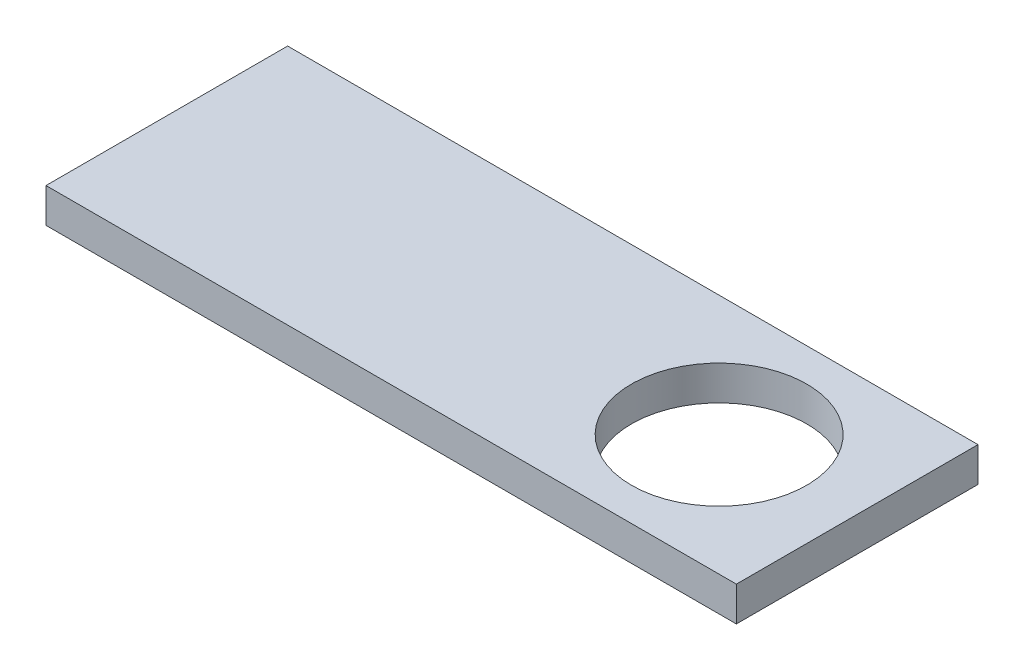
ISO-10303-21;
HEADER;
FILE_DESCRIPTION(('STEP AP214'),'2;1');
FILE_NAME('part.step','',(''),(''),'','','');
FILE_SCHEMA(('AUTOMOTIVE_DESIGN { 1 0 10303 214 1 1 1 1 }'));
ENDSEC;
DATA;
#1=APPLICATION_CONTEXT('core data for automotive mechanical design processes');
#2=APPLICATION_PROTOCOL_DEFINITION('international standard','automotive_design',2000,#1);
#3=PRODUCT_CONTEXT('',#1,'mechanical');
#4=PRODUCT('Part','Part','',(#3));
#5=PRODUCT_RELATED_PRODUCT_CATEGORY('part','',(#4));
#6=PRODUCT_DEFINITION_FORMATION('','',#4);
#7=PRODUCT_DEFINITION_CONTEXT('part definition',#1,'design');
#8=PRODUCT_DEFINITION('design','',#6,#7);
#9=PRODUCT_DEFINITION_SHAPE('','',#8);
#10=(LENGTH_UNIT() NAMED_UNIT(*) SI_UNIT(.MILLI.,.METRE.));
#11=(NAMED_UNIT(*) PLANE_ANGLE_UNIT() SI_UNIT($,.RADIAN.));
#12=(NAMED_UNIT(*) SI_UNIT($,.STERADIAN.) SOLID_ANGLE_UNIT());
#13=UNCERTAINTY_MEASURE_WITH_UNIT(LENGTH_MEASURE(1.E-05),#10,'distance_accuracy_value','');
#14=(GEOMETRIC_REPRESENTATION_CONTEXT(3) GLOBAL_UNCERTAINTY_ASSIGNED_CONTEXT((#13)) GLOBAL_UNIT_ASSIGNED_CONTEXT((#10,
#11,#12)) REPRESENTATION_CONTEXT('',''));
#15=CARTESIAN_POINT('',(0.,0.,0.));
#16=DIRECTION('',(0.,0.,1.));
#17=DIRECTION('',(1.,0.,0.));
#18=AXIS2_PLACEMENT_3D('',#15,#16,#17);
#19=CARTESIAN_POINT('',(0.,5.,0.));
#20=DIRECTION('',(0.,-1.,0.));
#21=DIRECTION('',(0.,0.,-1.));
#22=AXIS2_PLACEMENT_3D('',#19,#20,#21);
#23=PLANE('',#22);
#24=DIRECTION('',(0.,0.,-1.));
#25=VECTOR('',#24,1.);
#26=CARTESIAN_POINT('',(100.,5.,35.));
#27=LINE('',#26,#25);
#28=CARTESIAN_POINT('',(100.,5.,35.));
#29=VERTEX_POINT('',#28);
#30=CARTESIAN_POINT('',(100.,5.,-35.));
#31=VERTEX_POINT('',#30);
#32=EDGE_CURVE('E90',#29,#31,#27,.T.);
#33=ORIENTED_EDGE('',*,*,#32,.T.);
#34=DIRECTION('',(-1.,0.,0.));
#35=VECTOR('',#34,1.);
#36=CARTESIAN_POINT('',(-100.,5.,-35.));
#37=LINE('',#36,#35);
#38=CARTESIAN_POINT('',(-100.,5.,-35.));
#39=VERTEX_POINT('',#38);
#40=EDGE_CURVE('E85',#31,#39,#37,.T.);
#41=ORIENTED_EDGE('',*,*,#40,.T.);
#42=DIRECTION('',(0.,0.,1.));
#43=VECTOR('',#42,1.);
#44=CARTESIAN_POINT('',(-100.,5.,35.));
#45=LINE('',#44,#43);
#46=CARTESIAN_POINT('',(-100.,5.,35.));
#47=VERTEX_POINT('',#46);
#48=EDGE_CURVE('E88',#39,#47,#45,.T.);
#49=ORIENTED_EDGE('',*,*,#48,.T.);
#50=DIRECTION('',(1.,0.,0.));
#51=VECTOR('',#50,1.);
#52=CARTESIAN_POINT('',(-100.,5.,35.));
#53=LINE('',#52,#51);
#54=EDGE_CURVE('E55',#47,#29,#53,.T.);
#55=ORIENTED_EDGE('',*,*,#54,.T.);
#56=EDGE_LOOP('',(#33,#41,#49,#55));
#57=FACE_BOUND('',#56,.T.);
#58=CARTESIAN_POINT('',(60.,5.,0.));
#59=DIRECTION('',(0.,1.,0.));
#60=DIRECTION('',(0.,0.,1.));
#61=AXIS2_PLACEMENT_3D('',#58,#59,#60);
#62=CIRCLE('',#61,25.4);
#63=CARTESIAN_POINT('',(60.,5.,25.4));
#64=VERTEX_POINT('',#63);
#65=EDGE_CURVE('E105',#64,#64,#62,.T.);
#66=ORIENTED_EDGE('',*,*,#65,.F.);
#67=EDGE_LOOP('',(#66));
#68=FACE_BOUND('',#67,.T.);
#69=ADVANCED_FACE('F38',(#57,#68),#23,.F.);
#70=CARTESIAN_POINT('',(0.,-5.,0.));
#71=DIRECTION('',(0.,-1.,0.));
#72=DIRECTION('',(0.,0.,-1.));
#73=AXIS2_PLACEMENT_3D('',#70,#71,#72);
#74=PLANE('',#73);
#75=DIRECTION('',(0.,0.,-1.));
#76=VECTOR('',#75,1.);
#77=CARTESIAN_POINT('',(100.,-5.,35.));
#78=LINE('',#77,#76);
#79=CARTESIAN_POINT('',(100.,-5.,35.));
#80=VERTEX_POINT('',#79);
#81=CARTESIAN_POINT('',(100.,-5.,-35.));
#82=VERTEX_POINT('',#81);
#83=EDGE_CURVE('E102',#80,#82,#78,.T.);
#84=ORIENTED_EDGE('',*,*,#83,.F.);
#85=DIRECTION('',(1.,0.,0.));
#86=VECTOR('',#85,1.);
#87=CARTESIAN_POINT('',(-100.,-5.,35.));
#88=LINE('',#87,#86);
#89=CARTESIAN_POINT('',(-100.,-5.,35.));
#90=VERTEX_POINT('',#89);
#91=EDGE_CURVE('E78',#90,#80,#88,.T.);
#92=ORIENTED_EDGE('',*,*,#91,.F.);
#93=DIRECTION('',(0.,0.,1.));
#94=VECTOR('',#93,1.);
#95=CARTESIAN_POINT('',(-100.,-5.,35.));
#96=LINE('',#95,#94);
#97=CARTESIAN_POINT('',(-100.,-5.,-35.));
#98=VERTEX_POINT('',#97);
#99=EDGE_CURVE('E72',#98,#90,#96,.T.);
#100=ORIENTED_EDGE('',*,*,#99,.F.);
#101=DIRECTION('',(-1.,0.,0.));
#102=VECTOR('',#101,1.);
#103=CARTESIAN_POINT('',(-100.,-5.,-35.));
#104=LINE('',#103,#102);
#105=EDGE_CURVE('E94',#82,#98,#104,.T.);
#106=ORIENTED_EDGE('',*,*,#105,.F.);
#107=EDGE_LOOP('',(#84,#92,#100,#106));
#108=FACE_BOUND('',#107,.T.);
#109=CARTESIAN_POINT('',(60.,-5.,0.));
#110=DIRECTION('',(0.,1.,0.));
#111=DIRECTION('',(0.,0.,1.));
#112=AXIS2_PLACEMENT_3D('',#109,#110,#111);
#113=CIRCLE('',#112,25.4);
#114=CARTESIAN_POINT('',(60.,-5.,25.4));
#115=VERTEX_POINT('',#114);
#116=EDGE_CURVE('E117',#115,#115,#113,.T.);
#117=ORIENTED_EDGE('',*,*,#116,.T.);
#118=EDGE_LOOP('',(#117));
#119=FACE_BOUND('',#118,.T.);
#120=ADVANCED_FACE('F113',(#108,#119),#74,.T.);
#121=CARTESIAN_POINT('',(100.,5.,35.));
#122=DIRECTION('',(-1.,0.,0.));
#123=DIRECTION('',(0.,0.,1.));
#124=AXIS2_PLACEMENT_3D('',#121,#122,#123);
#125=PLANE('',#124);
#126=ORIENTED_EDGE('',*,*,#83,.T.);
#127=DIRECTION('',(0.,-1.,0.));
#128=VECTOR('',#127,1.);
#129=CARTESIAN_POINT('',(100.,5.,-35.));
#130=LINE('',#129,#128);
#131=EDGE_CURVE('E11',#31,#82,#130,.T.);
#132=ORIENTED_EDGE('',*,*,#131,.F.);
#133=ORIENTED_EDGE('',*,*,#32,.F.);
#134=DIRECTION('',(0.,-1.,0.));
#135=VECTOR('',#134,1.);
#136=CARTESIAN_POINT('',(100.,5.,35.));
#137=LINE('',#136,#135);
#138=EDGE_CURVE('E98',#29,#80,#137,.T.);
#139=ORIENTED_EDGE('',*,*,#138,.T.);
#140=EDGE_LOOP('',(#126,#132,#133,#139));
#141=FACE_BOUND('',#140,.T.);
#142=ADVANCED_FACE('F40',(#141),#125,.F.);
#143=CARTESIAN_POINT('',(-100.,5.,-35.));
#144=DIRECTION('',(0.,0.,1.));
#145=DIRECTION('',(1.,0.,0.));
#146=AXIS2_PLACEMENT_3D('',#143,#144,#145);
#147=PLANE('',#146);
#148=ORIENTED_EDGE('',*,*,#105,.T.);
#149=DIRECTION('',(0.,-1.,0.));
#150=VECTOR('',#149,1.);
#151=CARTESIAN_POINT('',(-100.,5.,-35.));
#152=LINE('',#151,#150);
#153=EDGE_CURVE('E47',#39,#98,#152,.T.);
#154=ORIENTED_EDGE('',*,*,#153,.F.);
#155=ORIENTED_EDGE('',*,*,#40,.F.);
#156=ORIENTED_EDGE('',*,*,#131,.T.);
#157=EDGE_LOOP('',(#148,#154,#155,#156));
#158=FACE_BOUND('',#157,.T.);
#159=ADVANCED_FACE('F93',(#158),#147,.F.);
#160=CARTESIAN_POINT('',(-100.,5.,35.));
#161=DIRECTION('',(1.,0.,0.));
#162=DIRECTION('',(0.,0.,-1.));
#163=AXIS2_PLACEMENT_3D('',#160,#161,#162);
#164=PLANE('',#163);
#165=ORIENTED_EDGE('',*,*,#99,.T.);
#166=DIRECTION('',(0.,-1.,0.));
#167=VECTOR('',#166,1.);
#168=CARTESIAN_POINT('',(-100.,5.,35.));
#169=LINE('',#168,#167);
#170=EDGE_CURVE('E95',#47,#90,#169,.T.);
#171=ORIENTED_EDGE('',*,*,#170,.F.);
#172=ORIENTED_EDGE('',*,*,#48,.F.);
#173=ORIENTED_EDGE('',*,*,#153,.T.);
#174=EDGE_LOOP('',(#165,#171,#172,#173));
#175=FACE_BOUND('',#174,.T.);
#176=ADVANCED_FACE('F96',(#175),#164,.F.);
#177=CARTESIAN_POINT('',(-100.,5.,35.));
#178=DIRECTION('',(0.,0.,-1.));
#179=DIRECTION('',(-1.,0.,0.));
#180=AXIS2_PLACEMENT_3D('',#177,#178,#179);
#181=PLANE('',#180);
#182=ORIENTED_EDGE('',*,*,#91,.T.);
#183=ORIENTED_EDGE('',*,*,#138,.F.);
#184=ORIENTED_EDGE('',*,*,#54,.F.);
#185=ORIENTED_EDGE('',*,*,#170,.T.);
#186=EDGE_LOOP('',(#182,#183,#184,#185));
#187=FACE_BOUND('',#186,.T.);
#188=ADVANCED_FACE('F110',(#187),#181,.F.);
#189=CARTESIAN_POINT('',(60.,5.,0.));
#190=DIRECTION('',(0.,-1.,0.));
#191=DIRECTION('',(0.,0.,-1.));
#192=AXIS2_PLACEMENT_3D('',#189,#190,#191);
#193=CYLINDRICAL_SURFACE('',#192,25.4);
#194=ORIENTED_EDGE('',*,*,#65,.T.);
#195=EDGE_LOOP('',(#194));
#196=FACE_BOUND('',#195,.T.);
#197=ORIENTED_EDGE('',*,*,#116,.F.);
#198=EDGE_LOOP('',(#197));
#199=FACE_BOUND('',#198,.T.);
#200=ADVANCED_FACE('F123',(#196,#199),#193,.F.);
#201=CLOSED_SHELL('',(#69,#120,#142,#159,#176,#188,#200));
#202=MANIFOLD_SOLID_BREP('B2',#201);
#203=ADVANCED_BREP_SHAPE_REPRESENTATION('',(#18,#202),#14);
#204=SHAPE_DEFINITION_REPRESENTATION(#9,#203);
ENDSEC;
END-ISO-10303-21;
